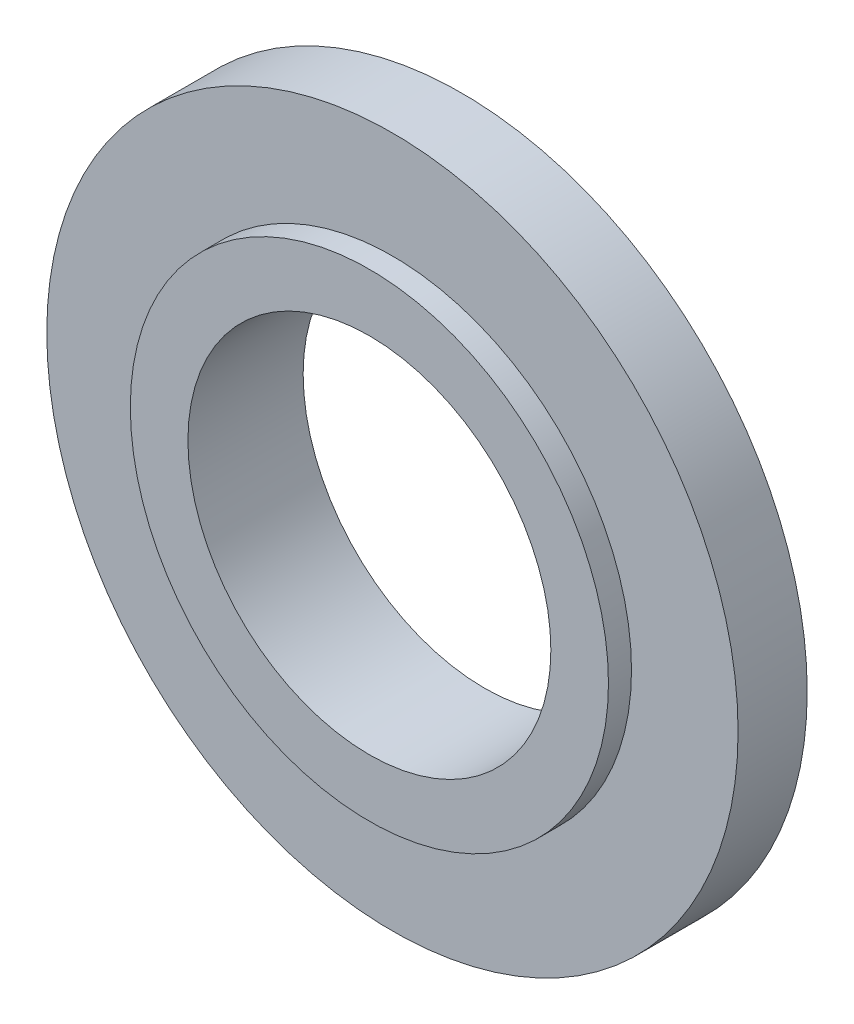
ISO-10303-21;
HEADER;
FILE_DESCRIPTION(('STEP AP214'),'2;1');
FILE_NAME('part.step','',(''),(''),'','','');
FILE_SCHEMA(('AUTOMOTIVE_DESIGN { 1 0 10303 214 1 1 1 1 }'));
ENDSEC;
DATA;
#1=APPLICATION_CONTEXT('core data for automotive mechanical design processes');
#2=APPLICATION_PROTOCOL_DEFINITION('international standard','automotive_design',2000,#1);
#3=PRODUCT_CONTEXT('',#1,'mechanical');
#4=PRODUCT('Part','Part','',(#3));
#5=PRODUCT_RELATED_PRODUCT_CATEGORY('part','',(#4));
#6=PRODUCT_DEFINITION_FORMATION('','',#4);
#7=PRODUCT_DEFINITION_CONTEXT('part definition',#1,'design');
#8=PRODUCT_DEFINITION('design','',#6,#7);
#9=PRODUCT_DEFINITION_SHAPE('','',#8);
#10=(LENGTH_UNIT() NAMED_UNIT(*) SI_UNIT(.MILLI.,.METRE.));
#11=(NAMED_UNIT(*) PLANE_ANGLE_UNIT() SI_UNIT($,.RADIAN.));
#12=(NAMED_UNIT(*) SI_UNIT($,.STERADIAN.) SOLID_ANGLE_UNIT());
#13=UNCERTAINTY_MEASURE_WITH_UNIT(LENGTH_MEASURE(1.E-05),#10,'distance_accuracy_value','');
#14=(GEOMETRIC_REPRESENTATION_CONTEXT(3) GLOBAL_UNCERTAINTY_ASSIGNED_CONTEXT((#13)) GLOBAL_UNIT_ASSIGNED_CONTEXT((#10,
#11,#12)) REPRESENTATION_CONTEXT('',''));
#15=CARTESIAN_POINT('',(0.,0.,0.));
#16=DIRECTION('',(0.,0.,1.));
#17=DIRECTION('',(1.,0.,0.));
#18=AXIS2_PLACEMENT_3D('',#15,#16,#17);
#19=CARTESIAN_POINT('',(0.,0.,0.));
#20=DIRECTION('',(0.,0.,1.));
#21=DIRECTION('',(1.,0.,0.));
#22=AXIS2_PLACEMENT_3D('',#19,#20,#21);
#23=PLANE('',#22);
#24=CARTESIAN_POINT('',(0.,0.,0.));
#25=DIRECTION('',(0.,0.,1.));
#26=DIRECTION('',(1.,0.,0.));
#27=AXIS2_PLACEMENT_3D('',#24,#25,#26);
#28=CIRCLE('',#27,3.15);
#29=CARTESIAN_POINT('',(3.15,0.,0.));
#30=VERTEX_POINT('',#29);
#31=EDGE_CURVE('E39',#30,#30,#28,.T.);
#32=ORIENTED_EDGE('',*,*,#31,.T.);
#33=EDGE_LOOP('',(#32));
#34=FACE_BOUND('',#33,.T.);
#35=CARTESIAN_POINT('',(0.,0.,0.));
#36=DIRECTION('',(0.,0.,1.));
#37=DIRECTION('',(1.,0.,0.));
#38=AXIS2_PLACEMENT_3D('',#35,#36,#37);
#39=CIRCLE('',#38,4.15);
#40=CARTESIAN_POINT('',(4.15,0.,0.));
#41=VERTEX_POINT('',#40);
#42=EDGE_CURVE('E60',#41,#41,#39,.T.);
#43=ORIENTED_EDGE('',*,*,#42,.F.);
#44=EDGE_LOOP('',(#43));
#45=FACE_BOUND('',#44,.T.);
#46=ADVANCED_FACE('F35',(#34,#45),#23,.F.);
#47=CARTESIAN_POINT('',(0.,0.,2.));
#48=DIRECTION('',(0.,0.,1.));
#49=DIRECTION('',(1.,0.,0.));
#50=AXIS2_PLACEMENT_3D('',#47,#48,#49);
#51=PLANE('',#50);
#52=CARTESIAN_POINT('',(0.,0.,2.));
#53=DIRECTION('',(0.,0.,1.));
#54=DIRECTION('',(1.,0.,0.));
#55=AXIS2_PLACEMENT_3D('',#52,#53,#54);
#56=CIRCLE('',#55,3.15);
#57=CARTESIAN_POINT('',(3.15,0.,2.));
#58=VERTEX_POINT('',#57);
#59=EDGE_CURVE('E10',#58,#58,#56,.T.);
#60=ORIENTED_EDGE('',*,*,#59,.F.);
#61=EDGE_LOOP('',(#60));
#62=FACE_BOUND('',#61,.T.);
#63=CARTESIAN_POINT('',(0.,0.,2.));
#64=DIRECTION('',(0.,0.,1.));
#65=DIRECTION('',(1.,0.,0.));
#66=AXIS2_PLACEMENT_3D('',#63,#64,#65);
#67=CIRCLE('',#66,4.15);
#68=CARTESIAN_POINT('',(4.15,0.,2.));
#69=VERTEX_POINT('',#68);
#70=EDGE_CURVE('E51',#69,#69,#67,.T.);
#71=ORIENTED_EDGE('',*,*,#70,.T.);
#72=EDGE_LOOP('',(#71));
#73=FACE_BOUND('',#72,.T.);
#74=ADVANCED_FACE('F75',(#62,#73),#51,.T.);
#75=CARTESIAN_POINT('',(0.,0.,2.));
#76=DIRECTION('',(0.,0.,-1.));
#77=DIRECTION('',(-1.,0.,0.));
#78=AXIS2_PLACEMENT_3D('',#75,#76,#77);
#79=CYLINDRICAL_SURFACE('',#78,6.);
#80=CARTESIAN_POINT('',(0.,0.,0.4));
#81=DIRECTION('',(0.,0.,1.));
#82=DIRECTION('',(1.,0.,0.));
#83=AXIS2_PLACEMENT_3D('',#80,#81,#82);
#84=CIRCLE('',#83,6.);
#85=CARTESIAN_POINT('',(6.,0.,0.4));
#86=VERTEX_POINT('',#85);
#87=EDGE_CURVE('E54',#86,#86,#84,.T.);
#88=ORIENTED_EDGE('',*,*,#87,.T.);
#89=EDGE_LOOP('',(#88));
#90=FACE_BOUND('',#89,.T.);
#91=CARTESIAN_POINT('',(0.,0.,1.6));
#92=DIRECTION('',(0.,0.,1.));
#93=DIRECTION('',(1.,0.,0.));
#94=AXIS2_PLACEMENT_3D('',#91,#92,#93);
#95=CIRCLE('',#94,6.);
#96=CARTESIAN_POINT('',(6.,0.,1.6));
#97=VERTEX_POINT('',#96);
#98=EDGE_CURVE('E46',#97,#97,#95,.T.);
#99=ORIENTED_EDGE('',*,*,#98,.F.);
#100=EDGE_LOOP('',(#99));
#101=FACE_BOUND('',#100,.T.);
#102=ADVANCED_FACE('F37',(#90,#101),#79,.T.);
#103=CARTESIAN_POINT('',(0.,0.,2.));
#104=DIRECTION('',(0.,0.,-1.));
#105=DIRECTION('',(-1.,0.,0.));
#106=AXIS2_PLACEMENT_3D('',#103,#104,#105);
#107=CYLINDRICAL_SURFACE('',#106,3.15);
#108=ORIENTED_EDGE('',*,*,#59,.T.);
#109=EDGE_LOOP('',(#108));
#110=FACE_BOUND('',#109,.T.);
#111=ORIENTED_EDGE('',*,*,#31,.F.);
#112=EDGE_LOOP('',(#111));
#113=FACE_BOUND('',#112,.T.);
#114=ADVANCED_FACE('F83',(#110,#113),#107,.F.);
#115=CARTESIAN_POINT('',(0.,0.,1.6));
#116=DIRECTION('',(0.,0.,1.));
#117=DIRECTION('',(1.,0.,0.));
#118=AXIS2_PLACEMENT_3D('',#115,#116,#117);
#119=PLANE('',#118);
#120=CARTESIAN_POINT('',(0.,0.,1.6));
#121=DIRECTION('',(0.,0.,1.));
#122=DIRECTION('',(1.,0.,0.));
#123=AXIS2_PLACEMENT_3D('',#120,#121,#122);
#124=CIRCLE('',#123,4.15);
#125=CARTESIAN_POINT('',(4.15,0.,1.6));
#126=VERTEX_POINT('',#125);
#127=EDGE_CURVE('E50',#126,#126,#124,.T.);
#128=ORIENTED_EDGE('',*,*,#127,.F.);
#129=EDGE_LOOP('',(#128));
#130=FACE_BOUND('',#129,.T.);
#131=ORIENTED_EDGE('',*,*,#98,.T.);
#132=EDGE_LOOP('',(#131));
#133=FACE_BOUND('',#132,.T.);
#134=ADVANCED_FACE('F86',(#130,#133),#119,.T.);
#135=CARTESIAN_POINT('',(0.,0.,1.6));
#136=DIRECTION('',(0.,0.,1.));
#137=DIRECTION('',(1.,0.,0.));
#138=AXIS2_PLACEMENT_3D('',#135,#136,#137);
#139=CYLINDRICAL_SURFACE('',#138,4.15);
#140=ORIENTED_EDGE('',*,*,#127,.T.);
#141=EDGE_LOOP('',(#140));
#142=FACE_BOUND('',#141,.T.);
#143=ORIENTED_EDGE('',*,*,#70,.F.);
#144=EDGE_LOOP('',(#143));
#145=FACE_BOUND('',#144,.T.);
#146=ADVANCED_FACE('F89',(#142,#145),#139,.T.);
#147=CARTESIAN_POINT('',(0.,0.,0.4));
#148=DIRECTION('',(0.,0.,1.));
#149=DIRECTION('',(1.,0.,0.));
#150=AXIS2_PLACEMENT_3D('',#147,#148,#149);
#151=PLANE('',#150);
#152=ORIENTED_EDGE('',*,*,#87,.F.);
#153=EDGE_LOOP('',(#152));
#154=FACE_BOUND('',#153,.T.);
#155=CARTESIAN_POINT('',(0.,0.,0.4));
#156=DIRECTION('',(0.,0.,1.));
#157=DIRECTION('',(1.,0.,0.));
#158=AXIS2_PLACEMENT_3D('',#155,#156,#157);
#159=CIRCLE('',#158,4.15);
#160=CARTESIAN_POINT('',(4.15,0.,0.4));
#161=VERTEX_POINT('',#160);
#162=EDGE_CURVE('E59',#161,#161,#159,.T.);
#163=ORIENTED_EDGE('',*,*,#162,.T.);
#164=EDGE_LOOP('',(#163));
#165=FACE_BOUND('',#164,.T.);
#166=ADVANCED_FACE('F66',(#154,#165),#151,.F.);
#167=CARTESIAN_POINT('',(0.,0.,0.4));
#168=DIRECTION('',(0.,0.,-1.));
#169=DIRECTION('',(-1.,0.,0.));
#170=AXIS2_PLACEMENT_3D('',#167,#168,#169);
#171=CYLINDRICAL_SURFACE('',#170,4.15);
#172=ORIENTED_EDGE('',*,*,#162,.F.);
#173=EDGE_LOOP('',(#172));
#174=FACE_BOUND('',#173,.T.);
#175=ORIENTED_EDGE('',*,*,#42,.T.);
#176=EDGE_LOOP('',(#175));
#177=FACE_BOUND('',#176,.T.);
#178=ADVANCED_FACE('F68',(#174,#177),#171,.T.);
#179=CLOSED_SHELL('',(#46,#74,#102,#114,#134,#146,#166,#178));
#180=MANIFOLD_SOLID_BREP('B2',#179);
#181=ADVANCED_BREP_SHAPE_REPRESENTATION('',(#18,#180),#14);
#182=SHAPE_DEFINITION_REPRESENTATION(#9,#181);
ENDSEC;
END-ISO-10303-21;
